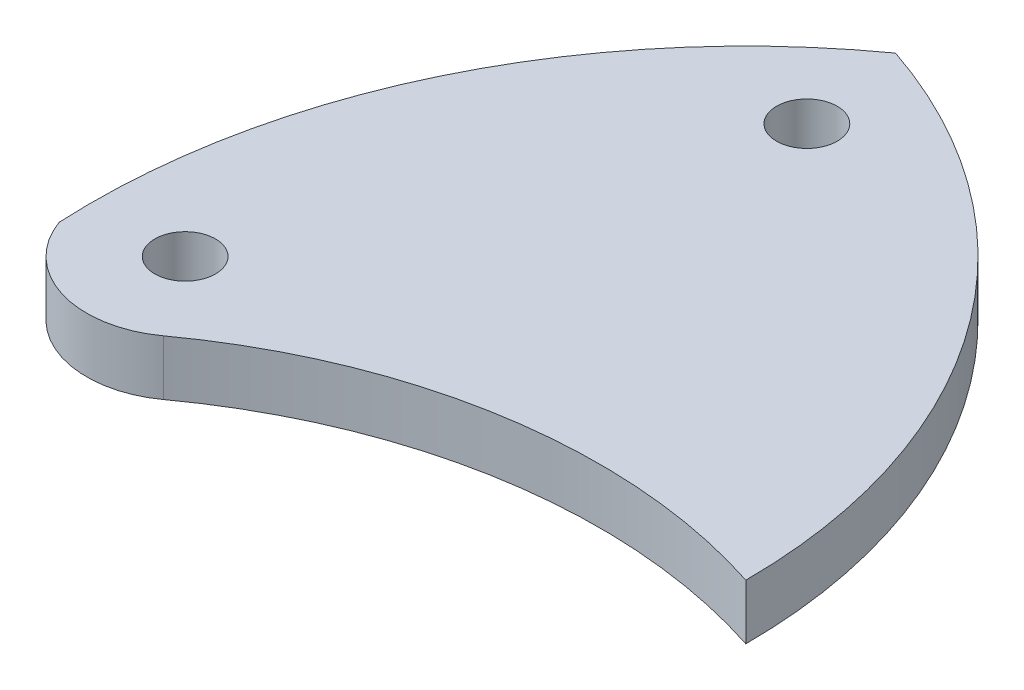
ISO-10303-21;
HEADER;
FILE_DESCRIPTION(('STEP AP214'),'2;1');
FILE_NAME('part.step','',(''),(''),'','','');
FILE_SCHEMA(('AUTOMOTIVE_DESIGN { 1 0 10303 214 1 1 1 1 }'));
ENDSEC;
DATA;
#1=APPLICATION_CONTEXT('core data for automotive mechanical design processes');
#2=APPLICATION_PROTOCOL_DEFINITION('international standard','automotive_design',2000,#1);
#3=PRODUCT_CONTEXT('',#1,'mechanical');
#4=PRODUCT('Part','Part','',(#3));
#5=PRODUCT_RELATED_PRODUCT_CATEGORY('part','',(#4));
#6=PRODUCT_DEFINITION_FORMATION('','',#4);
#7=PRODUCT_DEFINITION_CONTEXT('part definition',#1,'design');
#8=PRODUCT_DEFINITION('design','',#6,#7);
#9=PRODUCT_DEFINITION_SHAPE('','',#8);
#10=(LENGTH_UNIT() NAMED_UNIT(*) SI_UNIT(.MILLI.,.METRE.));
#11=(NAMED_UNIT(*) PLANE_ANGLE_UNIT() SI_UNIT($,.RADIAN.));
#12=(NAMED_UNIT(*) SI_UNIT($,.STERADIAN.) SOLID_ANGLE_UNIT());
#13=UNCERTAINTY_MEASURE_WITH_UNIT(LENGTH_MEASURE(1.E-05),#10,'distance_accuracy_value','');
#14=(GEOMETRIC_REPRESENTATION_CONTEXT(3) GLOBAL_UNCERTAINTY_ASSIGNED_CONTEXT((#13)) GLOBAL_UNIT_ASSIGNED_CONTEXT((#10,
#11,#12)) REPRESENTATION_CONTEXT('',''));
#15=CARTESIAN_POINT('',(0.,0.,0.));
#16=DIRECTION('',(0.,0.,1.));
#17=DIRECTION('',(1.,0.,0.));
#18=AXIS2_PLACEMENT_3D('',#15,#16,#17);
#19=CARTESIAN_POINT('',(0.,6.,0.));
#20=DIRECTION('',(0.,-1.,0.));
#21=DIRECTION('',(0.,0.,-1.));
#22=AXIS2_PLACEMENT_3D('',#19,#20,#21);
#23=CYLINDRICAL_SURFACE('',#22,71.12);
#24=CARTESIAN_POINT('',(0.,0.,0.));
#25=DIRECTION('',(0.,1.,0.));
#26=DIRECTION('',(0.,0.,1.));
#27=AXIS2_PLACEMENT_3D('',#24,#25,#26);
#28=CIRCLE('',#27,71.12);
#29=CARTESIAN_POINT('',(-41.4866666666667,0.,-57.7660011502344));
#30=VERTEX_POINT('',#29);
#31=CARTESIAN_POINT('',(-71.0271206032619,0.,3.63352980030329));
#32=VERTEX_POINT('',#31);
#33=EDGE_CURVE('E106',#30,#32,#28,.T.);
#34=ORIENTED_EDGE('',*,*,#33,.T.);
#35=DIRECTION('',(0.,-1.,0.));
#36=VECTOR('',#35,1.);
#37=CARTESIAN_POINT('',(-71.0271206032619,6.,3.63352980030329));
#38=LINE('',#37,#36);
#39=CARTESIAN_POINT('',(-71.0271206032619,6.,3.63352980030329));
#40=VERTEX_POINT('',#39);
#41=EDGE_CURVE('E11',#40,#32,#38,.T.);
#42=ORIENTED_EDGE('',*,*,#41,.F.);
#43=CARTESIAN_POINT('',(0.,6.,0.));
#44=DIRECTION('',(0.,1.,0.));
#45=DIRECTION('',(0.,0.,1.));
#46=AXIS2_PLACEMENT_3D('',#43,#44,#45);
#47=CIRCLE('',#46,71.12);
#48=CARTESIAN_POINT('',(-41.4866666666667,6.,-57.7660011502344));
#49=VERTEX_POINT('',#48);
#50=EDGE_CURVE('E85',#49,#40,#47,.T.);
#51=ORIENTED_EDGE('',*,*,#50,.F.);
#52=DIRECTION('',(0.,-1.,0.));
#53=VECTOR('',#52,1.);
#54=CARTESIAN_POINT('',(-41.4866666666667,6.,-57.7660011502344));
#55=LINE('',#54,#53);
#56=EDGE_CURVE('E96',#49,#30,#55,.T.);
#57=ORIENTED_EDGE('',*,*,#56,.T.);
#58=EDGE_LOOP('',(#34,#42,#51,#57));
#59=FACE_BOUND('',#58,.T.);
#60=ADVANCED_FACE('F37',(#59),#23,.T.);
#61=CARTESIAN_POINT('',(-60.96,6.,0.));
#62=DIRECTION('',(0.,-1.,0.));
#63=DIRECTION('',(0.,0.,-1.));
#64=AXIS2_PLACEMENT_3D('',#61,#62,#63);
#65=CYLINDRICAL_SURFACE('',#64,10.7027779594978);
#66=CARTESIAN_POINT('',(-60.96,0.,0.));
#67=DIRECTION('',(0.,1.,0.));
#68=DIRECTION('',(0.,0.,1.));
#69=AXIS2_PLACEMENT_3D('',#66,#67,#68);
#70=CIRCLE('',#69,10.7027779594978);
#71=CARTESIAN_POINT('',(-54.6690649568463,0.,8.65872925625534));
#72=VERTEX_POINT('',#71);
#73=EDGE_CURVE('E90',#32,#72,#70,.T.);
#74=ORIENTED_EDGE('',*,*,#73,.T.);
#75=DIRECTION('',(0.,-1.,0.));
#76=VECTOR('',#75,1.);
#77=CARTESIAN_POINT('',(-54.6690649568463,6.,8.65872925625534));
#78=LINE('',#77,#76);
#79=CARTESIAN_POINT('',(-54.6690649568463,6.,8.65872925625534));
#80=VERTEX_POINT('',#79);
#81=EDGE_CURVE('E46',#80,#72,#78,.T.);
#82=ORIENTED_EDGE('',*,*,#81,.F.);
#83=CARTESIAN_POINT('',(-60.96,6.,0.));
#84=DIRECTION('',(0.,1.,0.));
#85=DIRECTION('',(0.,0.,1.));
#86=AXIS2_PLACEMENT_3D('',#83,#84,#85);
#87=CIRCLE('',#86,10.7027779594978);
#88=EDGE_CURVE('E80',#40,#80,#87,.T.);
#89=ORIENTED_EDGE('',*,*,#88,.F.);
#90=ORIENTED_EDGE('',*,*,#41,.T.);
#91=EDGE_LOOP('',(#74,#82,#89,#90));
#92=FACE_BOUND('',#91,.T.);
#93=ADVANCED_FACE('F89',(#92),#65,.T.);
#94=CARTESIAN_POINT('',(-18.8376759770974,6.,57.9764052333524));
#95=DIRECTION('',(0.,-1.,0.));
#96=DIRECTION('',(0.,0.,-1.));
#97=AXIS2_PLACEMENT_3D('',#94,#95,#96);
#98=CYLINDRICAL_SURFACE('',#97,60.96);
#99=CARTESIAN_POINT('',(-18.8376759770974,0.,57.9764052333524));
#100=DIRECTION('',(0.,1.,0.));
#101=DIRECTION('',(0.,0.,1.));
#102=AXIS2_PLACEMENT_3D('',#99,#100,#101);
#103=CIRCLE('',#102,60.96);
#104=CARTESIAN_POINT('',(0.,0.,0.));
#105=VERTEX_POINT('',#104);
#106=EDGE_CURVE('E110',#105,#72,#103,.T.);
#107=ORIENTED_EDGE('',*,*,#106,.F.);
#108=DIRECTION('',(0.,-1.,0.));
#109=VECTOR('',#108,1.);
#110=CARTESIAN_POINT('',(0.,6.,0.));
#111=LINE('',#110,#109);
#112=CARTESIAN_POINT('',(0.,6.,0.));
#113=VERTEX_POINT('',#112);
#114=EDGE_CURVE('E70',#113,#105,#111,.T.);
#115=ORIENTED_EDGE('',*,*,#114,.F.);
#116=CARTESIAN_POINT('',(-18.8376759770974,6.,57.9764052333524));
#117=DIRECTION('',(0.,1.,0.));
#118=DIRECTION('',(0.,0.,1.));
#119=AXIS2_PLACEMENT_3D('',#116,#117,#118);
#120=CIRCLE('',#119,60.96);
#121=EDGE_CURVE('E83',#113,#80,#120,.T.);
#122=ORIENTED_EDGE('',*,*,#121,.T.);
#123=ORIENTED_EDGE('',*,*,#81,.T.);
#124=EDGE_LOOP('',(#107,#115,#122,#123));
#125=FACE_BOUND('',#124,.T.);
#126=ADVANCED_FACE('F94',(#125),#98,.F.);
#127=CARTESIAN_POINT('',(-60.96,6.,0.));
#128=DIRECTION('',(0.,-1.,0.));
#129=DIRECTION('',(0.,0.,-1.));
#130=AXIS2_PLACEMENT_3D('',#127,#128,#129);
#131=CYLINDRICAL_SURFACE('',#130,3.3);
#132=CARTESIAN_POINT('',(-60.96,6.,0.));
#133=DIRECTION('',(0.,1.,0.));
#134=DIRECTION('',(0.,0.,1.));
#135=AXIS2_PLACEMENT_3D('',#132,#133,#134);
#136=CIRCLE('',#135,3.3);
#137=CARTESIAN_POINT('',(-60.96,6.,3.3));
#138=VERTEX_POINT('',#137);
#139=EDGE_CURVE('E148',#138,#138,#136,.T.);
#140=ORIENTED_EDGE('',*,*,#139,.T.);
#141=EDGE_LOOP('',(#140));
#142=FACE_BOUND('',#141,.T.);
#143=CARTESIAN_POINT('',(-60.96,0.,0.));
#144=DIRECTION('',(0.,1.,0.));
#145=DIRECTION('',(0.,0.,1.));
#146=AXIS2_PLACEMENT_3D('',#143,#144,#145);
#147=CIRCLE('',#146,3.3);
#148=CARTESIAN_POINT('',(-60.96,0.,3.3));
#149=VERTEX_POINT('',#148);
#150=EDGE_CURVE('E103',#149,#149,#147,.T.);
#151=ORIENTED_EDGE('',*,*,#150,.F.);
#152=EDGE_LOOP('',(#151));
#153=FACE_BOUND('',#152,.T.);
#154=ADVANCED_FACE('F137',(#142,#153),#131,.F.);
#155=CARTESIAN_POINT('',(-39.6578970422099,6.,-46.2965743510624));
#156=DIRECTION('',(0.,-1.,0.));
#157=DIRECTION('',(0.,0.,-1.));
#158=AXIS2_PLACEMENT_3D('',#155,#156,#157);
#159=CYLINDRICAL_SURFACE('',#158,3.3);
#160=CARTESIAN_POINT('',(-39.6578970422099,6.,-46.2965743510624));
#161=DIRECTION('',(0.,1.,0.));
#162=DIRECTION('',(0.,0.,1.));
#163=AXIS2_PLACEMENT_3D('',#160,#161,#162);
#164=CIRCLE('',#163,3.3);
#165=CARTESIAN_POINT('',(-39.6578970422099,6.,-42.9965743510624));
#166=VERTEX_POINT('',#165);
#167=EDGE_CURVE('E113',#166,#166,#164,.T.);
#168=ORIENTED_EDGE('',*,*,#167,.T.);
#169=EDGE_LOOP('',(#168));
#170=FACE_BOUND('',#169,.T.);
#171=CARTESIAN_POINT('',(-39.6578970422099,0.,-46.2965743510624));
#172=DIRECTION('',(0.,1.,0.));
#173=DIRECTION('',(0.,0.,1.));
#174=AXIS2_PLACEMENT_3D('',#171,#172,#173);
#175=CIRCLE('',#174,3.3);
#176=CARTESIAN_POINT('',(-39.6578970422099,0.,-42.9965743510624));
#177=VERTEX_POINT('',#176);
#178=EDGE_CURVE('E100',#177,#177,#175,.T.);
#179=ORIENTED_EDGE('',*,*,#178,.F.);
#180=EDGE_LOOP('',(#179));
#181=FACE_BOUND('',#180,.T.);
#182=ADVANCED_FACE('F39',(#170,#181),#159,.F.);
#183=CARTESIAN_POINT('',(-60.96,6.,0.));
#184=DIRECTION('',(0.,-1.,0.));
#185=DIRECTION('',(0.,0.,-1.));
#186=AXIS2_PLACEMENT_3D('',#183,#184,#185);
#187=CYLINDRICAL_SURFACE('',#186,60.96);
#188=CARTESIAN_POINT('',(-60.96,0.,0.));
#189=DIRECTION('',(0.,1.,0.));
#190=DIRECTION('',(0.,0.,1.));
#191=AXIS2_PLACEMENT_3D('',#188,#189,#190);
#192=CIRCLE('',#191,60.96);
#193=EDGE_CURVE('E73',#105,#30,#192,.T.);
#194=ORIENTED_EDGE('',*,*,#193,.T.);
#195=ORIENTED_EDGE('',*,*,#56,.F.);
#196=CARTESIAN_POINT('',(-60.96,6.,0.));
#197=DIRECTION('',(0.,1.,0.));
#198=DIRECTION('',(0.,0.,1.));
#199=AXIS2_PLACEMENT_3D('',#196,#197,#198);
#200=CIRCLE('',#199,60.96);
#201=EDGE_CURVE('E54',#113,#49,#200,.T.);
#202=ORIENTED_EDGE('',*,*,#201,.F.);
#203=ORIENTED_EDGE('',*,*,#114,.T.);
#204=EDGE_LOOP('',(#194,#195,#202,#203));
#205=FACE_BOUND('',#204,.T.);
#206=ADVANCED_FACE('F125',(#205),#187,.T.);
#207=CARTESIAN_POINT('',(0.,6.,0.));
#208=DIRECTION('',(0.,1.,0.));
#209=DIRECTION('',(0.,0.,1.));
#210=AXIS2_PLACEMENT_3D('',#207,#208,#209);
#211=PLANE('',#210);
#212=ORIENTED_EDGE('',*,*,#167,.F.);
#213=EDGE_LOOP('',(#212));
#214=FACE_BOUND('',#213,.T.);
#215=ORIENTED_EDGE('',*,*,#139,.F.);
#216=EDGE_LOOP('',(#215));
#217=FACE_BOUND('',#216,.T.);
#218=ORIENTED_EDGE('',*,*,#50,.T.);
#219=ORIENTED_EDGE('',*,*,#88,.T.);
#220=ORIENTED_EDGE('',*,*,#121,.F.);
#221=ORIENTED_EDGE('',*,*,#201,.T.);
#222=EDGE_LOOP('',(#218,#219,#220,#221));
#223=FACE_BOUND('',#222,.T.);
#224=ADVANCED_FACE('F81',(#214,#217,#223),#211,.T.);
#225=CARTESIAN_POINT('',(0.,0.,0.));
#226=DIRECTION('',(0.,1.,0.));
#227=DIRECTION('',(0.,0.,1.));
#228=AXIS2_PLACEMENT_3D('',#225,#226,#227);
#229=PLANE('',#228);
#230=ORIENTED_EDGE('',*,*,#178,.T.);
#231=EDGE_LOOP('',(#230));
#232=FACE_BOUND('',#231,.T.);
#233=ORIENTED_EDGE('',*,*,#150,.T.);
#234=EDGE_LOOP('',(#233));
#235=FACE_BOUND('',#234,.T.);
#236=ORIENTED_EDGE('',*,*,#33,.F.);
#237=ORIENTED_EDGE('',*,*,#193,.F.);
#238=ORIENTED_EDGE('',*,*,#106,.T.);
#239=ORIENTED_EDGE('',*,*,#73,.F.);
#240=EDGE_LOOP('',(#236,#237,#238,#239));
#241=FACE_BOUND('',#240,.T.);
#242=ADVANCED_FACE('F118',(#232,#235,#241),#229,.F.);
#243=CLOSED_SHELL('',(#60,#93,#126,#154,#182,#206,#224,#242));
#244=MANIFOLD_SOLID_BREP('B2',#243);
#245=ADVANCED_BREP_SHAPE_REPRESENTATION('',(#18,#244),#14);
#246=SHAPE_DEFINITION_REPRESENTATION(#9,#245);
ENDSEC;
END-ISO-10303-21;
